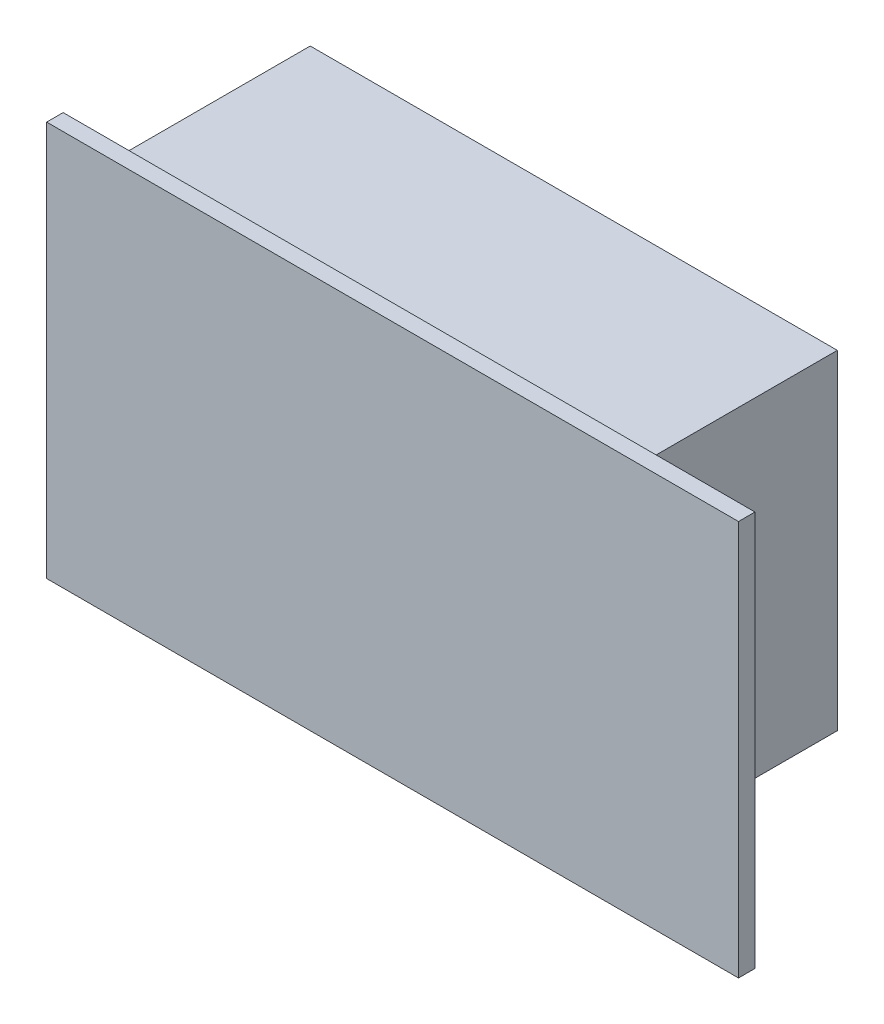
ISO-10303-21;
HEADER;
FILE_DESCRIPTION(('STEP AP214'),'2;1');
FILE_NAME('part.step','',(''),(''),'','','');
FILE_SCHEMA(('AUTOMOTIVE_DESIGN { 1 0 10303 214 1 1 1 1 }'));
ENDSEC;
DATA;
#1=APPLICATION_CONTEXT('core data for automotive mechanical design processes');
#2=APPLICATION_PROTOCOL_DEFINITION('international standard','automotive_design',2000,#1);
#3=PRODUCT_CONTEXT('',#1,'mechanical');
#4=PRODUCT('Part','Part','',(#3));
#5=PRODUCT_RELATED_PRODUCT_CATEGORY('part','',(#4));
#6=PRODUCT_DEFINITION_FORMATION('','',#4);
#7=PRODUCT_DEFINITION_CONTEXT('part definition',#1,'design');
#8=PRODUCT_DEFINITION('design','',#6,#7);
#9=PRODUCT_DEFINITION_SHAPE('','',#8);
#10=(LENGTH_UNIT() NAMED_UNIT(*) SI_UNIT(.MILLI.,.METRE.));
#11=(NAMED_UNIT(*) PLANE_ANGLE_UNIT() SI_UNIT($,.RADIAN.));
#12=(NAMED_UNIT(*) SI_UNIT($,.STERADIAN.) SOLID_ANGLE_UNIT());
#13=UNCERTAINTY_MEASURE_WITH_UNIT(LENGTH_MEASURE(1.E-05),#10,'distance_accuracy_value','');
#14=(GEOMETRIC_REPRESENTATION_CONTEXT(3) GLOBAL_UNCERTAINTY_ASSIGNED_CONTEXT((#13)) GLOBAL_UNIT_ASSIGNED_CONTEXT((#10,
#11,#12)) REPRESENTATION_CONTEXT('',''));
#15=CARTESIAN_POINT('',(0.,0.,0.));
#16=DIRECTION('',(0.,0.,1.));
#17=DIRECTION('',(1.,0.,0.));
#18=AXIS2_PLACEMENT_3D('',#15,#16,#17);
#19=CARTESIAN_POINT('',(0.,0.,0.1));
#20=DIRECTION('',(1.,0.,0.));
#21=DIRECTION('',(0.,1.,0.));
#22=AXIS2_PLACEMENT_3D('',#19,#20,#21);
#23=PLANE('',#22);
#24=DIRECTION('',(0.,-1.,0.));
#25=VECTOR('',#24,1.);
#26=CARTESIAN_POINT('',(0.,0.,0.));
#27=LINE('',#26,#25);
#28=CARTESIAN_POINT('',(0.,2.4,0.));
#29=VERTEX_POINT('',#28);
#30=CARTESIAN_POINT('',(0.,0.,0.));
#31=VERTEX_POINT('',#30);
#32=EDGE_CURVE('E195',#29,#31,#27,.T.);
#33=ORIENTED_EDGE('',*,*,#32,.T.);
#34=DIRECTION('',(0.,0.,-1.));
#35=VECTOR('',#34,1.);
#36=CARTESIAN_POINT('',(0.,0.,0.1));
#37=LINE('',#36,#35);
#38=CARTESIAN_POINT('',(0.,0.,0.1));
#39=VERTEX_POINT('',#38);
#40=EDGE_CURVE('E11',#39,#31,#37,.T.);
#41=ORIENTED_EDGE('',*,*,#40,.F.);
#42=DIRECTION('',(0.,-1.,0.));
#43=VECTOR('',#42,1.);
#44=CARTESIAN_POINT('',(0.,0.,0.1));
#45=LINE('',#44,#43);
#46=CARTESIAN_POINT('',(0.,2.4,0.1));
#47=VERTEX_POINT('',#46);
#48=EDGE_CURVE('E196',#47,#39,#45,.T.);
#49=ORIENTED_EDGE('',*,*,#48,.F.);
#50=DIRECTION('',(0.,0.,-1.));
#51=VECTOR('',#50,1.);
#52=CARTESIAN_POINT('',(0.,2.4,0.1));
#53=LINE('',#52,#51);
#54=EDGE_CURVE('E206',#47,#29,#53,.T.);
#55=ORIENTED_EDGE('',*,*,#54,.T.);
#56=EDGE_LOOP('',(#33,#41,#49,#55));
#57=FACE_BOUND('',#56,.T.);
#58=ADVANCED_FACE('F39',(#57),#23,.F.);
#59=CARTESIAN_POINT('',(0.,0.,0.1));
#60=DIRECTION('',(0.,1.,0.));
#61=DIRECTION('',(0.,0.,1.));
#62=AXIS2_PLACEMENT_3D('',#59,#60,#61);
#63=PLANE('',#62);
#64=DIRECTION('',(1.,0.,0.));
#65=VECTOR('',#64,1.);
#66=CARTESIAN_POINT('',(0.,0.,0.));
#67=LINE('',#66,#65);
#68=CARTESIAN_POINT('',(4.2,0.,0.));
#69=VERTEX_POINT('',#68);
#70=EDGE_CURVE('E209',#31,#69,#67,.T.);
#71=ORIENTED_EDGE('',*,*,#70,.T.);
#72=DIRECTION('',(0.,0.,-1.));
#73=VECTOR('',#72,1.);
#74=CARTESIAN_POINT('',(4.2,0.,0.1));
#75=LINE('',#74,#73);
#76=CARTESIAN_POINT('',(4.2,0.,0.1));
#77=VERTEX_POINT('',#76);
#78=EDGE_CURVE('E46',#77,#69,#75,.T.);
#79=ORIENTED_EDGE('',*,*,#78,.F.);
#80=DIRECTION('',(1.,0.,0.));
#81=VECTOR('',#80,1.);
#82=CARTESIAN_POINT('',(0.,0.,0.1));
#83=LINE('',#82,#81);
#84=EDGE_CURVE('E199',#39,#77,#83,.T.);
#85=ORIENTED_EDGE('',*,*,#84,.F.);
#86=ORIENTED_EDGE('',*,*,#40,.T.);
#87=EDGE_LOOP('',(#71,#79,#85,#86));
#88=FACE_BOUND('',#87,.T.);
#89=ADVANCED_FACE('F239',(#88),#63,.F.);
#90=CARTESIAN_POINT('',(4.2,0.,0.1));
#91=DIRECTION('',(-1.,0.,0.));
#92=DIRECTION('',(0.,-1.,0.));
#93=AXIS2_PLACEMENT_3D('',#90,#91,#92);
#94=PLANE('',#93);
#95=DIRECTION('',(0.,1.,0.));
#96=VECTOR('',#95,1.);
#97=CARTESIAN_POINT('',(4.2,0.,0.));
#98=LINE('',#97,#96);
#99=CARTESIAN_POINT('',(4.2,2.4,0.));
#100=VERTEX_POINT('',#99);
#101=EDGE_CURVE('E211',#69,#100,#98,.T.);
#102=ORIENTED_EDGE('',*,*,#101,.T.);
#103=DIRECTION('',(0.,0.,-1.));
#104=VECTOR('',#103,1.);
#105=CARTESIAN_POINT('',(4.2,2.4,0.1));
#106=LINE('',#105,#104);
#107=CARTESIAN_POINT('',(4.2,2.4,0.1));
#108=VERTEX_POINT('',#107);
#109=EDGE_CURVE('E216',#108,#100,#106,.T.);
#110=ORIENTED_EDGE('',*,*,#109,.F.);
#111=DIRECTION('',(0.,1.,0.));
#112=VECTOR('',#111,1.);
#113=CARTESIAN_POINT('',(4.2,0.,0.1));
#114=LINE('',#113,#112);
#115=EDGE_CURVE('E202',#77,#108,#114,.T.);
#116=ORIENTED_EDGE('',*,*,#115,.F.);
#117=ORIENTED_EDGE('',*,*,#78,.T.);
#118=EDGE_LOOP('',(#102,#110,#116,#117));
#119=FACE_BOUND('',#118,.T.);
#120=ADVANCED_FACE('F223',(#119),#94,.F.);
#121=CARTESIAN_POINT('',(0.,2.4,0.1));
#122=DIRECTION('',(0.,-1.,0.));
#123=DIRECTION('',(0.,0.,-1.));
#124=AXIS2_PLACEMENT_3D('',#121,#122,#123);
#125=PLANE('',#124);
#126=DIRECTION('',(-1.,0.,0.));
#127=VECTOR('',#126,1.);
#128=CARTESIAN_POINT('',(0.,2.4,0.));
#129=LINE('',#128,#127);
#130=EDGE_CURVE('E200',#100,#29,#129,.T.);
#131=ORIENTED_EDGE('',*,*,#130,.T.);
#132=ORIENTED_EDGE('',*,*,#54,.F.);
#133=DIRECTION('',(-1.,0.,0.));
#134=VECTOR('',#133,1.);
#135=CARTESIAN_POINT('',(0.,2.4,0.1));
#136=LINE('',#135,#134);
#137=EDGE_CURVE('E204',#108,#47,#136,.T.);
#138=ORIENTED_EDGE('',*,*,#137,.F.);
#139=ORIENTED_EDGE('',*,*,#109,.T.);
#140=EDGE_LOOP('',(#131,#132,#138,#139));
#141=FACE_BOUND('',#140,.T.);
#142=ADVANCED_FACE('F232',(#141),#125,.F.);
#143=CARTESIAN_POINT('',(0.,0.,0.1));
#144=DIRECTION('',(0.,0.,-1.));
#145=DIRECTION('',(-1.,0.,0.));
#146=AXIS2_PLACEMENT_3D('',#143,#144,#145);
#147=PLANE('',#146);
#148=ORIENTED_EDGE('',*,*,#48,.T.);
#149=ORIENTED_EDGE('',*,*,#84,.T.);
#150=ORIENTED_EDGE('',*,*,#115,.T.);
#151=ORIENTED_EDGE('',*,*,#137,.T.);
#152=EDGE_LOOP('',(#148,#149,#150,#151));
#153=FACE_BOUND('',#152,.T.);
#154=ADVANCED_FACE('F238',(#153),#147,.F.);
#155=CARTESIAN_POINT('',(0.,0.,0.));
#156=DIRECTION('',(0.,0.,-1.));
#157=DIRECTION('',(-1.,0.,0.));
#158=AXIS2_PLACEMENT_3D('',#155,#156,#157);
#159=PLANE('',#158);
#160=DIRECTION('',(0.,-1.,0.));
#161=VECTOR('',#160,1.);
#162=CARTESIAN_POINT('',(3.4,2.2,0.));
#163=LINE('',#162,#161);
#164=CARTESIAN_POINT('',(3.4,2.2,0.));
#165=VERTEX_POINT('',#164);
#166=CARTESIAN_POINT('',(3.4,0.2,0.));
#167=VERTEX_POINT('',#166);
#168=EDGE_CURVE('E61',#165,#167,#163,.T.);
#169=ORIENTED_EDGE('',*,*,#168,.F.);
#170=DIRECTION('',(1.,0.,0.));
#171=VECTOR('',#170,1.);
#172=CARTESIAN_POINT('',(3.4,2.2,0.));
#173=LINE('',#172,#171);
#174=CARTESIAN_POINT('',(0.199999999999999,2.2,0.));
#175=VERTEX_POINT('',#174);
#176=EDGE_CURVE('E169',#175,#165,#173,.T.);
#177=ORIENTED_EDGE('',*,*,#176,.F.);
#178=DIRECTION('',(0.,1.,0.));
#179=VECTOR('',#178,1.);
#180=CARTESIAN_POINT('',(0.199999999999999,2.2,0.));
#181=LINE('',#180,#179);
#182=CARTESIAN_POINT('',(0.199999999999999,0.2,0.));
#183=VERTEX_POINT('',#182);
#184=EDGE_CURVE('E180',#183,#175,#181,.T.);
#185=ORIENTED_EDGE('',*,*,#184,.F.);
#186=DIRECTION('',(-1.,0.,0.));
#187=VECTOR('',#186,1.);
#188=CARTESIAN_POINT('',(3.4,0.2,0.));
#189=LINE('',#188,#187);
#190=EDGE_CURVE('E177',#167,#183,#189,.T.);
#191=ORIENTED_EDGE('',*,*,#190,.F.);
#192=EDGE_LOOP('',(#169,#177,#185,#191));
#193=FACE_BOUND('',#192,.T.);
#194=ORIENTED_EDGE('',*,*,#32,.F.);
#195=ORIENTED_EDGE('',*,*,#130,.F.);
#196=ORIENTED_EDGE('',*,*,#101,.F.);
#197=ORIENTED_EDGE('',*,*,#70,.F.);
#198=EDGE_LOOP('',(#194,#195,#196,#197));
#199=FACE_BOUND('',#198,.T.);
#200=ADVANCED_FACE('F229',(#193,#199),#159,.T.);
#201=CARTESIAN_POINT('',(3.4,2.2,-1.3));
#202=DIRECTION('',(-1.,0.,0.));
#203=DIRECTION('',(0.,0.,1.));
#204=AXIS2_PLACEMENT_3D('',#201,#202,#203);
#205=PLANE('',#204);
#206=ORIENTED_EDGE('',*,*,#168,.T.);
#207=DIRECTION('',(0.,0.,1.));
#208=VECTOR('',#207,1.);
#209=CARTESIAN_POINT('',(3.4,0.2,-1.3));
#210=LINE('',#209,#208);
#211=CARTESIAN_POINT('',(3.4,0.2,-1.3));
#212=VERTEX_POINT('',#211);
#213=EDGE_CURVE('E192',#212,#167,#210,.T.);
#214=ORIENTED_EDGE('',*,*,#213,.F.);
#215=DIRECTION('',(0.,-1.,0.));
#216=VECTOR('',#215,1.);
#217=CARTESIAN_POINT('',(3.4,2.2,-1.3));
#218=LINE('',#217,#216);
#219=CARTESIAN_POINT('',(3.4,2.2,-1.3));
#220=VERTEX_POINT('',#219);
#221=EDGE_CURVE('E165',#220,#212,#218,.T.);
#222=ORIENTED_EDGE('',*,*,#221,.F.);
#223=DIRECTION('',(0.,0.,1.));
#224=VECTOR('',#223,1.);
#225=CARTESIAN_POINT('',(3.4,2.2,-1.3));
#226=LINE('',#225,#224);
#227=EDGE_CURVE('E175',#220,#165,#226,.T.);
#228=ORIENTED_EDGE('',*,*,#227,.T.);
#229=EDGE_LOOP('',(#206,#214,#222,#228));
#230=FACE_BOUND('',#229,.T.);
#231=ADVANCED_FACE('F251',(#230),#205,.F.);
#232=CARTESIAN_POINT('',(3.4,0.2,-1.3));
#233=DIRECTION('',(0.,1.,0.));
#234=DIRECTION('',(-1.,0.,0.));
#235=AXIS2_PLACEMENT_3D('',#232,#233,#234);
#236=PLANE('',#235);
#237=ORIENTED_EDGE('',*,*,#190,.T.);
#238=DIRECTION('',(0.,0.,1.));
#239=VECTOR('',#238,1.);
#240=CARTESIAN_POINT('',(0.199999999999999,0.2,-1.3));
#241=LINE('',#240,#239);
#242=CARTESIAN_POINT('',(0.199999999999999,0.2,-1.3));
#243=VERTEX_POINT('',#242);
#244=EDGE_CURVE('E189',#243,#183,#241,.T.);
#245=ORIENTED_EDGE('',*,*,#244,.F.);
#246=DIRECTION('',(-1.,0.,0.));
#247=VECTOR('',#246,1.);
#248=CARTESIAN_POINT('',(3.4,0.2,-1.3));
#249=LINE('',#248,#247);
#250=EDGE_CURVE('E168',#212,#243,#249,.T.);
#251=ORIENTED_EDGE('',*,*,#250,.F.);
#252=ORIENTED_EDGE('',*,*,#213,.T.);
#253=EDGE_LOOP('',(#237,#245,#251,#252));
#254=FACE_BOUND('',#253,.T.);
#255=ADVANCED_FACE('F256',(#254),#236,.F.);
#256=CARTESIAN_POINT('',(0.199999999999999,2.2,-1.3));
#257=DIRECTION('',(1.,0.,0.));
#258=DIRECTION('',(0.,1.,0.));
#259=AXIS2_PLACEMENT_3D('',#256,#257,#258);
#260=PLANE('',#259);
#261=ORIENTED_EDGE('',*,*,#184,.T.);
#262=DIRECTION('',(0.,0.,1.));
#263=VECTOR('',#262,1.);
#264=CARTESIAN_POINT('',(0.199999999999999,2.2,-1.3));
#265=LINE('',#264,#263);
#266=CARTESIAN_POINT('',(0.199999999999999,2.2,-1.3));
#267=VERTEX_POINT('',#266);
#268=EDGE_CURVE('E186',#267,#175,#265,.T.);
#269=ORIENTED_EDGE('',*,*,#268,.F.);
#270=DIRECTION('',(0.,1.,0.));
#271=VECTOR('',#270,1.);
#272=CARTESIAN_POINT('',(0.199999999999999,2.2,-1.3));
#273=LINE('',#272,#271);
#274=EDGE_CURVE('E171',#243,#267,#273,.T.);
#275=ORIENTED_EDGE('',*,*,#274,.F.);
#276=ORIENTED_EDGE('',*,*,#244,.T.);
#277=EDGE_LOOP('',(#261,#269,#275,#276));
#278=FACE_BOUND('',#277,.T.);
#279=ADVANCED_FACE('F260',(#278),#260,.F.);
#280=CARTESIAN_POINT('',(3.4,2.2,-1.3));
#281=DIRECTION('',(0.,-1.,0.));
#282=DIRECTION('',(1.,0.,0.));
#283=AXIS2_PLACEMENT_3D('',#280,#281,#282);
#284=PLANE('',#283);
#285=ORIENTED_EDGE('',*,*,#176,.T.);
#286=ORIENTED_EDGE('',*,*,#227,.F.);
#287=DIRECTION('',(1.,0.,0.));
#288=VECTOR('',#287,1.);
#289=CARTESIAN_POINT('',(3.4,2.2,-1.3));
#290=LINE('',#289,#288);
#291=EDGE_CURVE('E173',#267,#220,#290,.T.);
#292=ORIENTED_EDGE('',*,*,#291,.F.);
#293=ORIENTED_EDGE('',*,*,#268,.T.);
#294=EDGE_LOOP('',(#285,#286,#292,#293));
#295=FACE_BOUND('',#294,.T.);
#296=ADVANCED_FACE('F264',(#295),#284,.F.);
#297=CARTESIAN_POINT('',(0.,0.,-1.3));
#298=DIRECTION('',(0.,0.,-1.));
#299=DIRECTION('',(-1.,0.,0.));
#300=AXIS2_PLACEMENT_3D('',#297,#298,#299);
#301=PLANE('',#300);
#302=DIRECTION('',(0.,-1.,0.));
#303=VECTOR('',#302,1.);
#304=CARTESIAN_POINT('',(3.3,2.1,-1.3));
#305=LINE('',#304,#303);
#306=CARTESIAN_POINT('',(3.3,2.1,-1.3));
#307=VERTEX_POINT('',#306);
#308=CARTESIAN_POINT('',(3.3,0.3,-1.3));
#309=VERTEX_POINT('',#308);
#310=EDGE_CURVE('E53',#307,#309,#305,.T.);
#311=ORIENTED_EDGE('',*,*,#310,.F.);
#312=DIRECTION('',(1.,0.,0.));
#313=VECTOR('',#312,1.);
#314=CARTESIAN_POINT('',(3.3,2.1,-1.3));
#315=LINE('',#314,#313);
#316=CARTESIAN_POINT('',(0.299999999999999,2.1,-1.3));
#317=VERTEX_POINT('',#316);
#318=EDGE_CURVE('E147',#317,#307,#315,.T.);
#319=ORIENTED_EDGE('',*,*,#318,.F.);
#320=DIRECTION('',(0.,1.,0.));
#321=VECTOR('',#320,1.);
#322=CARTESIAN_POINT('',(0.299999999999999,2.1,-1.3));
#323=LINE('',#322,#321);
#324=CARTESIAN_POINT('',(0.299999999999999,0.3,-1.3));
#325=VERTEX_POINT('',#324);
#326=EDGE_CURVE('E150',#325,#317,#323,.T.);
#327=ORIENTED_EDGE('',*,*,#326,.F.);
#328=DIRECTION('',(-1.,0.,0.));
#329=VECTOR('',#328,1.);
#330=CARTESIAN_POINT('',(3.3,0.3,-1.3));
#331=LINE('',#330,#329);
#332=EDGE_CURVE('E156',#309,#325,#331,.T.);
#333=ORIENTED_EDGE('',*,*,#332,.F.);
#334=EDGE_LOOP('',(#311,#319,#327,#333));
#335=FACE_BOUND('',#334,.T.);
#336=ORIENTED_EDGE('',*,*,#221,.T.);
#337=ORIENTED_EDGE('',*,*,#250,.T.);
#338=ORIENTED_EDGE('',*,*,#274,.T.);
#339=ORIENTED_EDGE('',*,*,#291,.T.);
#340=EDGE_LOOP('',(#336,#337,#338,#339));
#341=FACE_BOUND('',#340,.T.);
#342=ADVANCED_FACE('F268',(#335,#341),#301,.T.);
#343=CARTESIAN_POINT('',(3.3,2.1,-1.29));
#344=DIRECTION('',(1.,0.,0.));
#345=DIRECTION('',(0.,0.,-1.));
#346=AXIS2_PLACEMENT_3D('',#343,#344,#345);
#347=PLANE('',#346);
#348=ORIENTED_EDGE('',*,*,#310,.T.);
#349=DIRECTION('',(0.,0.,-1.));
#350=VECTOR('',#349,1.);
#351=CARTESIAN_POINT('',(3.3,0.3,-1.29));
#352=LINE('',#351,#350);
#353=CARTESIAN_POINT('',(3.3,0.3,-1.29));
#354=VERTEX_POINT('',#353);
#355=EDGE_CURVE('E125',#354,#309,#352,.T.);
#356=ORIENTED_EDGE('',*,*,#355,.F.);
#357=DIRECTION('',(0.,-1.,0.));
#358=VECTOR('',#357,1.);
#359=CARTESIAN_POINT('',(3.3,2.1,-1.29));
#360=LINE('',#359,#358);
#361=CARTESIAN_POINT('',(3.3,2.1,-1.29));
#362=VERTEX_POINT('',#361);
#363=EDGE_CURVE('E129',#362,#354,#360,.T.);
#364=ORIENTED_EDGE('',*,*,#363,.F.);
#365=DIRECTION('',(0.,0.,-1.));
#366=VECTOR('',#365,1.);
#367=CARTESIAN_POINT('',(3.3,2.1,-1.29));
#368=LINE('',#367,#366);
#369=EDGE_CURVE('E160',#362,#307,#368,.T.);
#370=ORIENTED_EDGE('',*,*,#369,.T.);
#371=EDGE_LOOP('',(#348,#356,#364,#370));
#372=FACE_BOUND('',#371,.T.);
#373=ADVANCED_FACE('F127',(#372),#347,.F.);
#374=CARTESIAN_POINT('',(3.3,2.1,-1.29));
#375=DIRECTION('',(0.,1.,0.));
#376=DIRECTION('',(0.,0.,1.));
#377=AXIS2_PLACEMENT_3D('',#374,#375,#376);
#378=PLANE('',#377);
#379=ORIENTED_EDGE('',*,*,#318,.T.);
#380=ORIENTED_EDGE('',*,*,#369,.F.);
#381=DIRECTION('',(1.,0.,0.));
#382=VECTOR('',#381,1.);
#383=CARTESIAN_POINT('',(3.3,2.1,-1.29));
#384=LINE('',#383,#382);
#385=CARTESIAN_POINT('',(0.299999999999999,2.1,-1.29));
#386=VERTEX_POINT('',#385);
#387=EDGE_CURVE('E135',#386,#362,#384,.T.);
#388=ORIENTED_EDGE('',*,*,#387,.F.);
#389=DIRECTION('',(0.,0.,-1.));
#390=VECTOR('',#389,1.);
#391=CARTESIAN_POINT('',(0.299999999999999,2.1,-1.29));
#392=LINE('',#391,#390);
#393=EDGE_CURVE('E162',#386,#317,#392,.T.);
#394=ORIENTED_EDGE('',*,*,#393,.T.);
#395=EDGE_LOOP('',(#379,#380,#388,#394));
#396=FACE_BOUND('',#395,.T.);
#397=ADVANCED_FACE('F275',(#396),#378,.F.);
#398=CARTESIAN_POINT('',(0.299999999999999,2.1,-1.29));
#399=DIRECTION('',(-1.,0.,0.));
#400=DIRECTION('',(0.,-1.,0.));
#401=AXIS2_PLACEMENT_3D('',#398,#399,#400);
#402=PLANE('',#401);
#403=ORIENTED_EDGE('',*,*,#326,.T.);
#404=ORIENTED_EDGE('',*,*,#393,.F.);
#405=DIRECTION('',(0.,1.,0.));
#406=VECTOR('',#405,1.);
#407=CARTESIAN_POINT('',(0.299999999999999,2.1,-1.29));
#408=LINE('',#407,#406);
#409=CARTESIAN_POINT('',(0.299999999999999,0.3,-1.29));
#410=VERTEX_POINT('',#409);
#411=EDGE_CURVE('E143',#410,#386,#408,.T.);
#412=ORIENTED_EDGE('',*,*,#411,.F.);
#413=DIRECTION('',(0.,0.,-1.));
#414=VECTOR('',#413,1.);
#415=CARTESIAN_POINT('',(0.299999999999999,0.3,-1.29));
#416=LINE('',#415,#414);
#417=EDGE_CURVE('E134',#410,#325,#416,.T.);
#418=ORIENTED_EDGE('',*,*,#417,.T.);
#419=EDGE_LOOP('',(#403,#404,#412,#418));
#420=FACE_BOUND('',#419,.T.);
#421=ADVANCED_FACE('F278',(#420),#402,.F.);
#422=CARTESIAN_POINT('',(3.3,0.3,-1.29));
#423=DIRECTION('',(0.,-1.,0.));
#424=DIRECTION('',(0.,0.,-1.));
#425=AXIS2_PLACEMENT_3D('',#422,#423,#424);
#426=PLANE('',#425);
#427=ORIENTED_EDGE('',*,*,#332,.T.);
#428=ORIENTED_EDGE('',*,*,#417,.F.);
#429=DIRECTION('',(-1.,0.,0.));
#430=VECTOR('',#429,1.);
#431=CARTESIAN_POINT('',(3.3,0.3,-1.29));
#432=LINE('',#431,#430);
#433=EDGE_CURVE('E138',#354,#410,#432,.T.);
#434=ORIENTED_EDGE('',*,*,#433,.F.);
#435=ORIENTED_EDGE('',*,*,#355,.T.);
#436=EDGE_LOOP('',(#427,#428,#434,#435));
#437=FACE_BOUND('',#436,.T.);
#438=ADVANCED_FACE('F139',(#437),#426,.F.);
#439=CARTESIAN_POINT('',(0.,0.,-1.29));
#440=DIRECTION('',(0.,0.,-1.));
#441=DIRECTION('',(-1.,0.,0.));
#442=AXIS2_PLACEMENT_3D('',#439,#440,#441);
#443=PLANE('',#442);
#444=ORIENTED_EDGE('',*,*,#363,.T.);
#445=ORIENTED_EDGE('',*,*,#433,.T.);
#446=ORIENTED_EDGE('',*,*,#411,.T.);
#447=ORIENTED_EDGE('',*,*,#387,.T.);
#448=EDGE_LOOP('',(#444,#445,#446,#447));
#449=FACE_BOUND('',#448,.T.);
#450=ADVANCED_FACE('F145',(#449),#443,.T.);
#451=CLOSED_SHELL('',(#58,#89,#120,#142,#154,#200,#231,#255,#279,#296,#342,#373,#397,#421,#438,#450));
#452=MANIFOLD_SOLID_BREP('B2',#451);
#453=ADVANCED_BREP_SHAPE_REPRESENTATION('',(#18,#452),#14);
#454=SHAPE_DEFINITION_REPRESENTATION(#9,#453);
ENDSEC;
END-ISO-10303-21;
